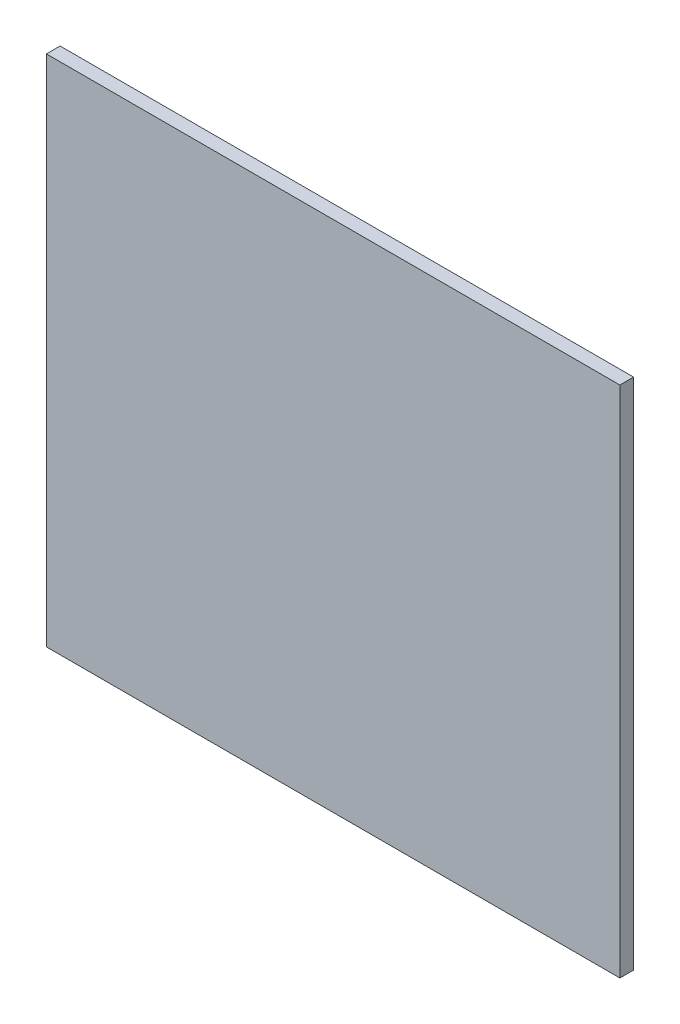
ISO-10303-21;
HEADER;
FILE_DESCRIPTION(('STEP AP214'),'2;1');
FILE_NAME('part.step','',(''),(''),'','','');
FILE_SCHEMA(('AUTOMOTIVE_DESIGN { 1 0 10303 214 1 1 1 1 }'));
ENDSEC;
DATA;
#1=APPLICATION_CONTEXT('core data for automotive mechanical design processes');
#2=APPLICATION_PROTOCOL_DEFINITION('international standard','automotive_design',2000,#1);
#3=PRODUCT_CONTEXT('',#1,'mechanical');
#4=PRODUCT('Part','Part','',(#3));
#5=PRODUCT_RELATED_PRODUCT_CATEGORY('part','',(#4));
#6=PRODUCT_DEFINITION_FORMATION('','',#4);
#7=PRODUCT_DEFINITION_CONTEXT('part definition',#1,'design');
#8=PRODUCT_DEFINITION('design','',#6,#7);
#9=PRODUCT_DEFINITION_SHAPE('','',#8);
#10=(LENGTH_UNIT() NAMED_UNIT(*) SI_UNIT(.MILLI.,.METRE.));
#11=(NAMED_UNIT(*) PLANE_ANGLE_UNIT() SI_UNIT($,.RADIAN.));
#12=(NAMED_UNIT(*) SI_UNIT($,.STERADIAN.) SOLID_ANGLE_UNIT());
#13=UNCERTAINTY_MEASURE_WITH_UNIT(LENGTH_MEASURE(1.E-05),#10,'distance_accuracy_value','');
#14=(GEOMETRIC_REPRESENTATION_CONTEXT(3) GLOBAL_UNCERTAINTY_ASSIGNED_CONTEXT((#13)) GLOBAL_UNIT_ASSIGNED_CONTEXT((#10,
#11,#12)) REPRESENTATION_CONTEXT('',''));
#15=CARTESIAN_POINT('',(0.,0.,0.));
#16=DIRECTION('',(0.,0.,1.));
#17=DIRECTION('',(1.,0.,0.));
#18=AXIS2_PLACEMENT_3D('',#15,#16,#17);
#19=CARTESIAN_POINT('',(106.3625,-95.25,5.08));
#20=DIRECTION('',(-1.,0.,0.));
#21=DIRECTION('',(0.,0.,1.));
#22=AXIS2_PLACEMENT_3D('',#19,#20,#21);
#23=PLANE('',#22);
#24=DIRECTION('',(0.,1.,0.));
#25=VECTOR('',#24,1.);
#26=CARTESIAN_POINT('',(106.3625,-95.25,0.));
#27=LINE('',#26,#25);
#28=CARTESIAN_POINT('',(106.3625,-95.25,0.));
#29=VERTEX_POINT('',#28);
#30=CARTESIAN_POINT('',(106.3625,95.25,0.));
#31=VERTEX_POINT('',#30);
#32=EDGE_CURVE('E104',#29,#31,#27,.T.);
#33=ORIENTED_EDGE('',*,*,#32,.T.);
#34=DIRECTION('',(0.,0.,-1.));
#35=VECTOR('',#34,1.);
#36=CARTESIAN_POINT('',(106.3625,95.25,5.08));
#37=LINE('',#36,#35);
#38=CARTESIAN_POINT('',(106.3625,95.25,5.08));
#39=VERTEX_POINT('',#38);
#40=EDGE_CURVE('E11',#39,#31,#37,.T.);
#41=ORIENTED_EDGE('',*,*,#40,.F.);
#42=DIRECTION('',(0.,1.,0.));
#43=VECTOR('',#42,1.);
#44=CARTESIAN_POINT('',(106.3625,-95.25,5.08));
#45=LINE('',#44,#43);
#46=CARTESIAN_POINT('',(106.3625,-95.25,5.08));
#47=VERTEX_POINT('',#46);
#48=EDGE_CURVE('E92',#47,#39,#45,.T.);
#49=ORIENTED_EDGE('',*,*,#48,.F.);
#50=DIRECTION('',(0.,0.,-1.));
#51=VECTOR('',#50,1.);
#52=CARTESIAN_POINT('',(106.3625,-95.25,5.08));
#53=LINE('',#52,#51);
#54=EDGE_CURVE('E100',#47,#29,#53,.T.);
#55=ORIENTED_EDGE('',*,*,#54,.T.);
#56=EDGE_LOOP('',(#33,#41,#49,#55));
#57=FACE_BOUND('',#56,.T.);
#58=ADVANCED_FACE('F41',(#57),#23,.F.);
#59=CARTESIAN_POINT('',(-106.3625,95.25,5.08));
#60=DIRECTION('',(0.,-1.,0.));
#61=DIRECTION('',(0.,0.,-1.));
#62=AXIS2_PLACEMENT_3D('',#59,#60,#61);
#63=PLANE('',#62);
#64=DIRECTION('',(-1.,0.,0.));
#65=VECTOR('',#64,1.);
#66=CARTESIAN_POINT('',(-106.3625,95.25,0.));
#67=LINE('',#66,#65);
#68=CARTESIAN_POINT('',(-106.3625,95.25,0.));
#69=VERTEX_POINT('',#68);
#70=EDGE_CURVE('E96',#31,#69,#67,.T.);
#71=ORIENTED_EDGE('',*,*,#70,.T.);
#72=DIRECTION('',(0.,0.,-1.));
#73=VECTOR('',#72,1.);
#74=CARTESIAN_POINT('',(-106.3625,95.25,5.08));
#75=LINE('',#74,#73);
#76=CARTESIAN_POINT('',(-106.3625,95.25,5.08));
#77=VERTEX_POINT('',#76);
#78=EDGE_CURVE('E49',#77,#69,#75,.T.);
#79=ORIENTED_EDGE('',*,*,#78,.F.);
#80=DIRECTION('',(-1.,0.,0.));
#81=VECTOR('',#80,1.);
#82=CARTESIAN_POINT('',(-106.3625,95.25,5.08));
#83=LINE('',#82,#81);
#84=EDGE_CURVE('E87',#39,#77,#83,.T.);
#85=ORIENTED_EDGE('',*,*,#84,.F.);
#86=ORIENTED_EDGE('',*,*,#40,.T.);
#87=EDGE_LOOP('',(#71,#79,#85,#86));
#88=FACE_BOUND('',#87,.T.);
#89=ADVANCED_FACE('F95',(#88),#63,.F.);
#90=CARTESIAN_POINT('',(-106.3625,-95.25,5.08));
#91=DIRECTION('',(1.,0.,0.));
#92=DIRECTION('',(0.,0.,-1.));
#93=AXIS2_PLACEMENT_3D('',#90,#91,#92);
#94=PLANE('',#93);
#95=DIRECTION('',(0.,-1.,0.));
#96=VECTOR('',#95,1.);
#97=CARTESIAN_POINT('',(-106.3625,-95.25,0.));
#98=LINE('',#97,#96);
#99=CARTESIAN_POINT('',(-106.3625,-95.25,0.));
#100=VERTEX_POINT('',#99);
#101=EDGE_CURVE('E74',#69,#100,#98,.T.);
#102=ORIENTED_EDGE('',*,*,#101,.T.);
#103=DIRECTION('',(0.,0.,-1.));
#104=VECTOR('',#103,1.);
#105=CARTESIAN_POINT('',(-106.3625,-95.25,5.08));
#106=LINE('',#105,#104);
#107=CARTESIAN_POINT('',(-106.3625,-95.25,5.08));
#108=VERTEX_POINT('',#107);
#109=EDGE_CURVE('E97',#108,#100,#106,.T.);
#110=ORIENTED_EDGE('',*,*,#109,.F.);
#111=DIRECTION('',(0.,-1.,0.));
#112=VECTOR('',#111,1.);
#113=CARTESIAN_POINT('',(-106.3625,-95.25,5.08));
#114=LINE('',#113,#112);
#115=EDGE_CURVE('E90',#77,#108,#114,.T.);
#116=ORIENTED_EDGE('',*,*,#115,.F.);
#117=ORIENTED_EDGE('',*,*,#78,.T.);
#118=EDGE_LOOP('',(#102,#110,#116,#117));
#119=FACE_BOUND('',#118,.T.);
#120=ADVANCED_FACE('F98',(#119),#94,.F.);
#121=CARTESIAN_POINT('',(-106.3625,-95.25,5.08));
#122=DIRECTION('',(0.,1.,0.));
#123=DIRECTION('',(0.,0.,1.));
#124=AXIS2_PLACEMENT_3D('',#121,#122,#123);
#125=PLANE('',#124);
#126=DIRECTION('',(1.,0.,0.));
#127=VECTOR('',#126,1.);
#128=CARTESIAN_POINT('',(-106.3625,-95.25,0.));
#129=LINE('',#128,#127);
#130=EDGE_CURVE('E80',#100,#29,#129,.T.);
#131=ORIENTED_EDGE('',*,*,#130,.T.);
#132=ORIENTED_EDGE('',*,*,#54,.F.);
#133=DIRECTION('',(1.,0.,0.));
#134=VECTOR('',#133,1.);
#135=CARTESIAN_POINT('',(-106.3625,-95.25,5.08));
#136=LINE('',#135,#134);
#137=EDGE_CURVE('E57',#108,#47,#136,.T.);
#138=ORIENTED_EDGE('',*,*,#137,.F.);
#139=ORIENTED_EDGE('',*,*,#109,.T.);
#140=EDGE_LOOP('',(#131,#132,#138,#139));
#141=FACE_BOUND('',#140,.T.);
#142=ADVANCED_FACE('F111',(#141),#125,.F.);
#143=CARTESIAN_POINT('',(0.,0.,5.08));
#144=DIRECTION('',(0.,0.,-1.));
#145=DIRECTION('',(-1.,0.,0.));
#146=AXIS2_PLACEMENT_3D('',#143,#144,#145);
#147=PLANE('',#146);
#148=ORIENTED_EDGE('',*,*,#48,.T.);
#149=ORIENTED_EDGE('',*,*,#84,.T.);
#150=ORIENTED_EDGE('',*,*,#115,.T.);
#151=ORIENTED_EDGE('',*,*,#137,.T.);
#152=EDGE_LOOP('',(#148,#149,#150,#151));
#153=FACE_BOUND('',#152,.T.);
#154=ADVANCED_FACE('F88',(#153),#147,.F.);
#155=CARTESIAN_POINT('',(0.,0.,0.));
#156=DIRECTION('',(0.,0.,-1.));
#157=DIRECTION('',(-1.,0.,0.));
#158=AXIS2_PLACEMENT_3D('',#155,#156,#157);
#159=PLANE('',#158);
#160=ORIENTED_EDGE('',*,*,#32,.F.);
#161=ORIENTED_EDGE('',*,*,#130,.F.);
#162=ORIENTED_EDGE('',*,*,#101,.F.);
#163=ORIENTED_EDGE('',*,*,#70,.F.);
#164=EDGE_LOOP('',(#160,#161,#162,#163));
#165=FACE_BOUND('',#164,.T.);
#166=ADVANCED_FACE('F114',(#165),#159,.T.);
#167=CLOSED_SHELL('',(#58,#89,#120,#142,#154,#166));
#168=MANIFOLD_SOLID_BREP('B2',#167);
#169=ADVANCED_BREP_SHAPE_REPRESENTATION('',(#18,#168),#14);
#170=SHAPE_DEFINITION_REPRESENTATION(#9,#169);
ENDSEC;
END-ISO-10303-21;
